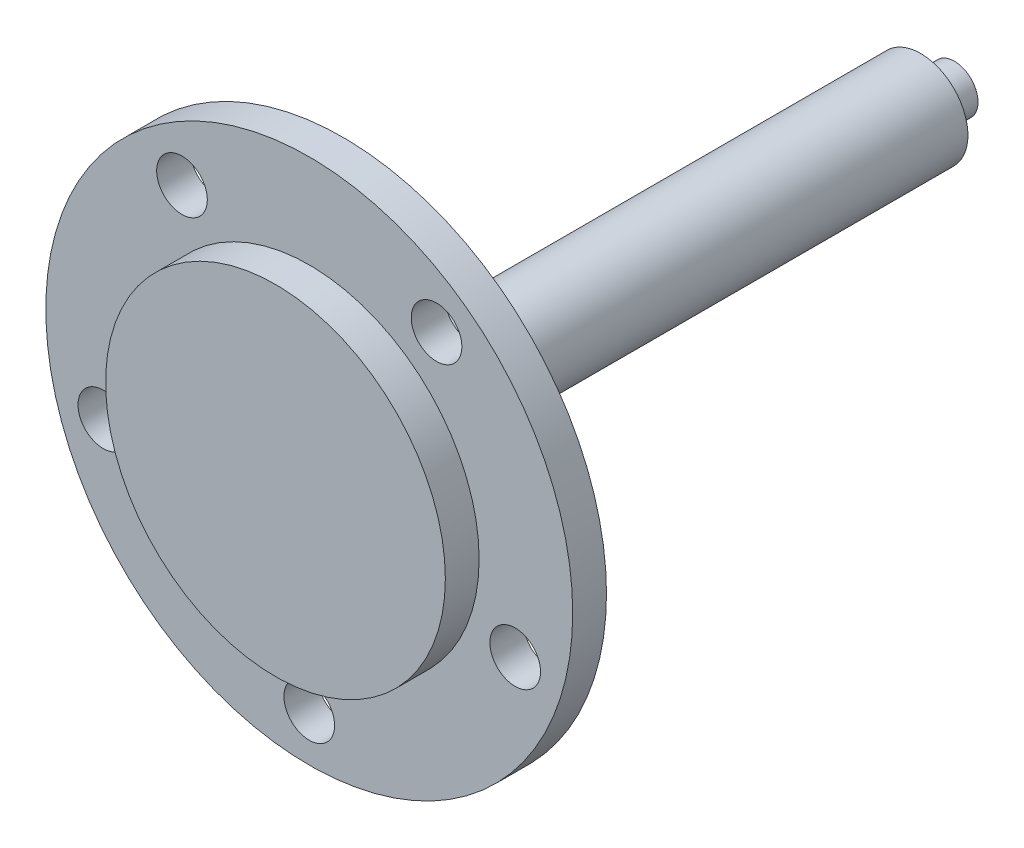
ISO-10303-21;
HEADER;
FILE_DESCRIPTION(('STEP AP214'),'2;1');
FILE_NAME('part.step','',(''),(''),'','','');
FILE_SCHEMA(('AUTOMOTIVE_DESIGN { 1 0 10303 214 1 1 1 1 }'));
ENDSEC;
DATA;
#1=APPLICATION_CONTEXT('core data for automotive mechanical design processes');
#2=APPLICATION_PROTOCOL_DEFINITION('international standard','automotive_design',2000,#1);
#3=PRODUCT_CONTEXT('',#1,'mechanical');
#4=PRODUCT('Part','Part','',(#3));
#5=PRODUCT_RELATED_PRODUCT_CATEGORY('part','',(#4));
#6=PRODUCT_DEFINITION_FORMATION('','',#4);
#7=PRODUCT_DEFINITION_CONTEXT('part definition',#1,'design');
#8=PRODUCT_DEFINITION('design','',#6,#7);
#9=PRODUCT_DEFINITION_SHAPE('','',#8);
#10=(LENGTH_UNIT() NAMED_UNIT(*) SI_UNIT(.MILLI.,.METRE.));
#11=(NAMED_UNIT(*) PLANE_ANGLE_UNIT() SI_UNIT($,.RADIAN.));
#12=(NAMED_UNIT(*) SI_UNIT($,.STERADIAN.) SOLID_ANGLE_UNIT());
#13=UNCERTAINTY_MEASURE_WITH_UNIT(LENGTH_MEASURE(1.E-05),#10,'distance_accuracy_value','');
#14=(GEOMETRIC_REPRESENTATION_CONTEXT(3) GLOBAL_UNCERTAINTY_ASSIGNED_CONTEXT((#13)) GLOBAL_UNIT_ASSIGNED_CONTEXT((#10,
#11,#12)) REPRESENTATION_CONTEXT('',''));
#15=CARTESIAN_POINT('',(0.,0.,0.));
#16=DIRECTION('',(0.,0.,1.));
#17=DIRECTION('',(1.,0.,0.));
#18=AXIS2_PLACEMENT_3D('',#15,#16,#17);
#19=CARTESIAN_POINT('',(0.,0.,18.));
#20=DIRECTION('',(0.,0.,-1.));
#21=DIRECTION('',(-1.,0.,0.));
#22=AXIS2_PLACEMENT_3D('',#19,#20,#21);
#23=CYLINDRICAL_SURFACE('',#22,14.);
#24=CARTESIAN_POINT('',(0.,0.,-3.));
#25=DIRECTION('',(0.,0.,-1.));
#26=DIRECTION('',(-1.,0.,0.));
#27=AXIS2_PLACEMENT_3D('',#24,#25,#26);
#28=CIRCLE('',#27,14.);
#29=CARTESIAN_POINT('',(-14.,0.,-3.));
#30=VERTEX_POINT('',#29);
#31=EDGE_CURVE('E39',#30,#30,#28,.T.);
#32=ORIENTED_EDGE('',*,*,#31,.F.);
#33=EDGE_LOOP('',(#32));
#34=FACE_BOUND('',#33,.T.);
#35=CARTESIAN_POINT('',(0.,0.,168.));
#36=DIRECTION('',(0.,0.,1.));
#37=DIRECTION('',(1.,0.,0.));
#38=AXIS2_PLACEMENT_3D('',#35,#36,#37);
#39=CIRCLE('',#38,14.);
#40=CARTESIAN_POINT('',(14.,0.,168.));
#41=VERTEX_POINT('',#40);
#42=EDGE_CURVE('E90',#41,#41,#39,.T.);
#43=ORIENTED_EDGE('',*,*,#42,.F.);
#44=EDGE_LOOP('',(#43));
#45=FACE_BOUND('',#44,.T.);
#46=ADVANCED_FACE('F36',(#34,#45),#23,.T.);
#47=CARTESIAN_POINT('',(0.,0.,-3.));
#48=DIRECTION('',(0.,0.,-1.));
#49=DIRECTION('',(-1.,0.,0.));
#50=AXIS2_PLACEMENT_3D('',#47,#48,#49);
#51=PLANE('',#50);
#52=CARTESIAN_POINT('',(0.,0.,-3.));
#53=DIRECTION('',(0.,0.,-1.));
#54=DIRECTION('',(-1.,0.,0.));
#55=AXIS2_PLACEMENT_3D('',#52,#53,#54);
#56=CIRCLE('',#55,7.);
#57=CARTESIAN_POINT('',(-7.,0.,-3.));
#58=VERTEX_POINT('',#57);
#59=EDGE_CURVE('E43',#58,#58,#56,.T.);
#60=ORIENTED_EDGE('',*,*,#59,.F.);
#61=EDGE_LOOP('',(#60));
#62=FACE_BOUND('',#61,.T.);
#63=ORIENTED_EDGE('',*,*,#31,.T.);
#64=EDGE_LOOP('',(#63));
#65=FACE_BOUND('',#64,.T.);
#66=ADVANCED_FACE('F97',(#62,#65),#51,.T.);
#67=CARTESIAN_POINT('',(0.,0.,-13.));
#68=DIRECTION('',(0.,0.,1.));
#69=DIRECTION('',(1.,0.,0.));
#70=AXIS2_PLACEMENT_3D('',#67,#68,#69);
#71=CYLINDRICAL_SURFACE('',#70,7.);
#72=CARTESIAN_POINT('',(0.,0.,-13.));
#73=DIRECTION('',(0.,0.,-1.));
#74=DIRECTION('',(-1.,0.,0.));
#75=AXIS2_PLACEMENT_3D('',#72,#73,#74);
#76=CIRCLE('',#75,7.);
#77=CARTESIAN_POINT('',(-7.,0.,-13.));
#78=VERTEX_POINT('',#77);
#79=EDGE_CURVE('E86',#78,#78,#76,.T.);
#80=ORIENTED_EDGE('',*,*,#79,.F.);
#81=EDGE_LOOP('',(#80));
#82=FACE_BOUND('',#81,.T.);
#83=ORIENTED_EDGE('',*,*,#59,.T.);
#84=EDGE_LOOP('',(#83));
#85=FACE_BOUND('',#84,.T.);
#86=ADVANCED_FACE('F104',(#82,#85),#71,.T.);
#87=CARTESIAN_POINT('',(0.,0.,-13.));
#88=DIRECTION('',(0.,0.,-1.));
#89=DIRECTION('',(-1.,0.,0.));
#90=AXIS2_PLACEMENT_3D('',#87,#88,#89);
#91=PLANE('',#90);
#92=ORIENTED_EDGE('',*,*,#79,.T.);
#93=EDGE_LOOP('',(#92));
#94=FACE_BOUND('',#93,.T.);
#95=ADVANCED_FACE('F109',(#94),#91,.T.);
#96=CARTESIAN_POINT('',(0.,0.,178.));
#97=DIRECTION('',(0.,0.,1.));
#98=DIRECTION('',(1.,0.,0.));
#99=AXIS2_PLACEMENT_3D('',#96,#97,#98);
#100=PLANE('',#99);
#101=CARTESIAN_POINT('',(0.,0.,178.));
#102=DIRECTION('',(0.,0.,1.));
#103=DIRECTION('',(1.,0.,0.));
#104=AXIS2_PLACEMENT_3D('',#101,#102,#103);
#105=CIRCLE('',#104,50.291796038);
#106=CARTESIAN_POINT('',(50.291796038,0.,178.));
#107=VERTEX_POINT('',#106);
#108=EDGE_CURVE('E10',#107,#107,#105,.T.);
#109=ORIENTED_EDGE('',*,*,#108,.F.);
#110=EDGE_LOOP('',(#109));
#111=FACE_BOUND('',#110,.T.);
#112=CARTESIAN_POINT('',(37.6815411803324,51.8641920160985,178.));
#113=DIRECTION('',(0.,0.,1.));
#114=DIRECTION('',(1.,0.,0.));
#115=AXIS2_PLACEMENT_3D('',#112,#113,#114);
#116=CIRCLE('',#115,7.5);
#117=CARTESIAN_POINT('',(45.1815411803324,51.8641920160985,178.));
#118=VERTEX_POINT('',#117);
#119=EDGE_CURVE('E59',#118,#118,#116,.T.);
#120=ORIENTED_EDGE('',*,*,#119,.F.);
#121=EDGE_LOOP('',(#120));
#122=FACE_BOUND('',#121,.T.);
#123=CARTESIAN_POINT('',(-60.9700143782559,-19.8103585510986,178.));
#124=DIRECTION('',(0.,0.,1.));
#125=DIRECTION('',(1.,0.,0.));
#126=AXIS2_PLACEMENT_3D('',#123,#124,#125);
#127=CIRCLE('',#126,7.50000000000001);
#128=CARTESIAN_POINT('',(-53.4700143782559,-19.8103585510986,178.));
#129=VERTEX_POINT('',#128);
#130=EDGE_CURVE('E71',#129,#129,#127,.T.);
#131=ORIENTED_EDGE('',*,*,#130,.F.);
#132=EDGE_LOOP('',(#131));
#133=FACE_BOUND('',#132,.T.);
#134=CARTESIAN_POINT('',(0.,0.,178.));
#135=DIRECTION('',(0.,0.,1.));
#136=DIRECTION('',(1.,0.,0.));
#137=AXIS2_PLACEMENT_3D('',#134,#135,#136);
#138=CIRCLE('',#137,78.);
#139=CARTESIAN_POINT('',(78.,0.,178.));
#140=VERTEX_POINT('',#139);
#141=EDGE_CURVE('E83',#140,#140,#138,.T.);
#142=ORIENTED_EDGE('',*,*,#141,.T.);
#143=EDGE_LOOP('',(#142));
#144=FACE_BOUND('',#143,.T.);
#145=CARTESIAN_POINT('',(0.,-64.10766693,178.));
#146=DIRECTION('',(0.,0.,1.));
#147=DIRECTION('',(1.,0.,0.));
#148=AXIS2_PLACEMENT_3D('',#145,#146,#147);
#149=CIRCLE('',#148,7.5);
#150=CARTESIAN_POINT('',(7.5,-64.10766693,178.));
#151=VERTEX_POINT('',#150);
#152=EDGE_CURVE('E77',#151,#151,#149,.T.);
#153=ORIENTED_EDGE('',*,*,#152,.F.);
#154=EDGE_LOOP('',(#153));
#155=FACE_BOUND('',#154,.T.);
#156=CARTESIAN_POINT('',(-37.6815411803316,51.864192016099,178.));
#157=DIRECTION('',(0.,0.,1.));
#158=DIRECTION('',(1.,0.,0.));
#159=AXIS2_PLACEMENT_3D('',#156,#157,#158);
#160=CIRCLE('',#159,7.5);
#161=CARTESIAN_POINT('',(-30.1815411803316,51.864192016099,178.));
#162=VERTEX_POINT('',#161);
#163=EDGE_CURVE('E65',#162,#162,#160,.T.);
#164=ORIENTED_EDGE('',*,*,#163,.F.);
#165=EDGE_LOOP('',(#164));
#166=FACE_BOUND('',#165,.T.);
#167=CARTESIAN_POINT('',(60.9700143782556,-19.8103585510995,178.));
#168=DIRECTION('',(0.,0.,1.));
#169=DIRECTION('',(1.,0.,0.));
#170=AXIS2_PLACEMENT_3D('',#167,#168,#169);
#171=CIRCLE('',#170,7.5);
#172=CARTESIAN_POINT('',(68.4700143782556,-19.8103585510995,178.));
#173=VERTEX_POINT('',#172);
#174=EDGE_CURVE('E52',#173,#173,#171,.T.);
#175=ORIENTED_EDGE('',*,*,#174,.F.);
#176=EDGE_LOOP('',(#175));
#177=FACE_BOUND('',#176,.T.);
#178=ADVANCED_FACE('F116',(#111,#122,#133,#144,#155,#166,#177),#100,.T.);
#179=CARTESIAN_POINT('',(0.,0.,168.));
#180=DIRECTION('',(0.,0.,1.));
#181=DIRECTION('',(1.,0.,0.));
#182=AXIS2_PLACEMENT_3D('',#179,#180,#181);
#183=PLANE('',#182);
#184=ORIENTED_EDGE('',*,*,#42,.T.);
#185=EDGE_LOOP('',(#184));
#186=FACE_BOUND('',#185,.T.);
#187=CARTESIAN_POINT('',(0.,0.,168.));
#188=DIRECTION('',(0.,0.,1.));
#189=DIRECTION('',(1.,0.,0.));
#190=AXIS2_PLACEMENT_3D('',#187,#188,#189);
#191=CIRCLE('',#190,78.);
#192=CARTESIAN_POINT('',(78.,0.,168.));
#193=VERTEX_POINT('',#192);
#194=EDGE_CURVE('E80',#193,#193,#191,.T.);
#195=ORIENTED_EDGE('',*,*,#194,.F.);
#196=EDGE_LOOP('',(#195));
#197=FACE_BOUND('',#196,.T.);
#198=CARTESIAN_POINT('',(0.,-64.10766693,168.));
#199=DIRECTION('',(0.,0.,1.));
#200=DIRECTION('',(1.,0.,0.));
#201=AXIS2_PLACEMENT_3D('',#198,#199,#200);
#202=CIRCLE('',#201,7.5);
#203=CARTESIAN_POINT('',(7.5,-64.10766693,168.));
#204=VERTEX_POINT('',#203);
#205=EDGE_CURVE('E74',#204,#204,#202,.T.);
#206=ORIENTED_EDGE('',*,*,#205,.T.);
#207=EDGE_LOOP('',(#206));
#208=FACE_BOUND('',#207,.T.);
#209=CARTESIAN_POINT('',(-60.9700143782559,-19.8103585510986,168.));
#210=DIRECTION('',(0.,0.,1.));
#211=DIRECTION('',(1.,0.,0.));
#212=AXIS2_PLACEMENT_3D('',#209,#210,#211);
#213=CIRCLE('',#212,7.50000000000001);
#214=CARTESIAN_POINT('',(-53.4700143782559,-19.8103585510986,168.));
#215=VERTEX_POINT('',#214);
#216=EDGE_CURVE('E68',#215,#215,#213,.T.);
#217=ORIENTED_EDGE('',*,*,#216,.T.);
#218=EDGE_LOOP('',(#217));
#219=FACE_BOUND('',#218,.T.);
#220=CARTESIAN_POINT('',(-37.6815411803316,51.864192016099,168.));
#221=DIRECTION('',(0.,0.,1.));
#222=DIRECTION('',(1.,0.,0.));
#223=AXIS2_PLACEMENT_3D('',#220,#221,#222);
#224=CIRCLE('',#223,7.5);
#225=CARTESIAN_POINT('',(-30.1815411803316,51.864192016099,168.));
#226=VERTEX_POINT('',#225);
#227=EDGE_CURVE('E62',#226,#226,#224,.T.);
#228=ORIENTED_EDGE('',*,*,#227,.T.);
#229=EDGE_LOOP('',(#228));
#230=FACE_BOUND('',#229,.T.);
#231=CARTESIAN_POINT('',(37.6815411803324,51.8641920160985,168.));
#232=DIRECTION('',(0.,0.,1.));
#233=DIRECTION('',(1.,0.,0.));
#234=AXIS2_PLACEMENT_3D('',#231,#232,#233);
#235=CIRCLE('',#234,7.5);
#236=CARTESIAN_POINT('',(45.1815411803324,51.8641920160985,168.));
#237=VERTEX_POINT('',#236);
#238=EDGE_CURVE('E55',#237,#237,#235,.T.);
#239=ORIENTED_EDGE('',*,*,#238,.T.);
#240=EDGE_LOOP('',(#239));
#241=FACE_BOUND('',#240,.T.);
#242=CARTESIAN_POINT('',(60.9700143782556,-19.8103585510995,168.));
#243=DIRECTION('',(0.,0.,1.));
#244=DIRECTION('',(1.,0.,0.));
#245=AXIS2_PLACEMENT_3D('',#242,#243,#244);
#246=CIRCLE('',#245,7.5);
#247=CARTESIAN_POINT('',(68.4700143782556,-19.8103585510995,168.));
#248=VERTEX_POINT('',#247);
#249=EDGE_CURVE('E56',#248,#248,#246,.T.);
#250=ORIENTED_EDGE('',*,*,#249,.T.);
#251=EDGE_LOOP('',(#250));
#252=FACE_BOUND('',#251,.T.);
#253=ADVANCED_FACE('F122',(#186,#197,#208,#219,#230,#241,#252),#183,.F.);
#254=CARTESIAN_POINT('',(0.,0.,178.));
#255=DIRECTION('',(0.,0.,-1.));
#256=DIRECTION('',(-1.,0.,0.));
#257=AXIS2_PLACEMENT_3D('',#254,#255,#256);
#258=CYLINDRICAL_SURFACE('',#257,78.);
#259=ORIENTED_EDGE('',*,*,#141,.F.);
#260=EDGE_LOOP('',(#259));
#261=FACE_BOUND('',#260,.T.);
#262=ORIENTED_EDGE('',*,*,#194,.T.);
#263=EDGE_LOOP('',(#262));
#264=FACE_BOUND('',#263,.T.);
#265=ADVANCED_FACE('F118',(#261,#264),#258,.T.);
#266=CARTESIAN_POINT('',(0.,-64.10766693,178.));
#267=DIRECTION('',(0.,0.,-1.));
#268=DIRECTION('',(-1.,0.,0.));
#269=AXIS2_PLACEMENT_3D('',#266,#267,#268);
#270=CYLINDRICAL_SURFACE('',#269,7.5);
#271=ORIENTED_EDGE('',*,*,#152,.T.);
#272=EDGE_LOOP('',(#271));
#273=FACE_BOUND('',#272,.T.);
#274=ORIENTED_EDGE('',*,*,#205,.F.);
#275=EDGE_LOOP('',(#274));
#276=FACE_BOUND('',#275,.T.);
#277=ADVANCED_FACE('F121',(#273,#276),#270,.F.);
#278=CARTESIAN_POINT('',(-60.9700143782559,-19.8103585510986,178.));
#279=DIRECTION('',(0.,0.,-1.));
#280=DIRECTION('',(-1.,0.,0.));
#281=AXIS2_PLACEMENT_3D('',#278,#279,#280);
#282=CYLINDRICAL_SURFACE('',#281,7.50000000000001);
#283=ORIENTED_EDGE('',*,*,#130,.T.);
#284=EDGE_LOOP('',(#283));
#285=FACE_BOUND('',#284,.T.);
#286=ORIENTED_EDGE('',*,*,#216,.F.);
#287=EDGE_LOOP('',(#286));
#288=FACE_BOUND('',#287,.T.);
#289=ADVANCED_FACE('F131',(#285,#288),#282,.F.);
#290=CARTESIAN_POINT('',(-37.6815411803316,51.864192016099,178.));
#291=DIRECTION('',(0.,0.,-1.));
#292=DIRECTION('',(-1.,0.,0.));
#293=AXIS2_PLACEMENT_3D('',#290,#291,#292);
#294=CYLINDRICAL_SURFACE('',#293,7.5);
#295=ORIENTED_EDGE('',*,*,#163,.T.);
#296=EDGE_LOOP('',(#295));
#297=FACE_BOUND('',#296,.T.);
#298=ORIENTED_EDGE('',*,*,#227,.F.);
#299=EDGE_LOOP('',(#298));
#300=FACE_BOUND('',#299,.T.);
#301=ADVANCED_FACE('F135',(#297,#300),#294,.F.);
#302=CARTESIAN_POINT('',(37.6815411803324,51.8641920160985,178.));
#303=DIRECTION('',(0.,0.,-1.));
#304=DIRECTION('',(-1.,0.,0.));
#305=AXIS2_PLACEMENT_3D('',#302,#303,#304);
#306=CYLINDRICAL_SURFACE('',#305,7.5);
#307=ORIENTED_EDGE('',*,*,#119,.T.);
#308=EDGE_LOOP('',(#307));
#309=FACE_BOUND('',#308,.T.);
#310=ORIENTED_EDGE('',*,*,#238,.F.);
#311=EDGE_LOOP('',(#310));
#312=FACE_BOUND('',#311,.T.);
#313=ADVANCED_FACE('F139',(#309,#312),#306,.F.);
#314=CARTESIAN_POINT('',(60.9700143782556,-19.8103585510995,178.));
#315=DIRECTION('',(0.,0.,-1.));
#316=DIRECTION('',(-1.,0.,0.));
#317=AXIS2_PLACEMENT_3D('',#314,#315,#316);
#318=CYLINDRICAL_SURFACE('',#317,7.5);
#319=ORIENTED_EDGE('',*,*,#174,.T.);
#320=EDGE_LOOP('',(#319));
#321=FACE_BOUND('',#320,.T.);
#322=ORIENTED_EDGE('',*,*,#249,.F.);
#323=EDGE_LOOP('',(#322));
#324=FACE_BOUND('',#323,.T.);
#325=ADVANCED_FACE('F143',(#321,#324),#318,.F.);
#326=CARTESIAN_POINT('',(0.,0.,188.));
#327=DIRECTION('',(0.,0.,-1.));
#328=DIRECTION('',(-1.,0.,0.));
#329=AXIS2_PLACEMENT_3D('',#326,#327,#328);
#330=CYLINDRICAL_SURFACE('',#329,50.291796038);
#331=CARTESIAN_POINT('',(0.,0.,188.));
#332=DIRECTION('',(0.,0.,1.));
#333=DIRECTION('',(1.,0.,0.));
#334=AXIS2_PLACEMENT_3D('',#331,#332,#333);
#335=CIRCLE('',#334,50.291796038);
#336=CARTESIAN_POINT('',(50.291796038,0.,188.));
#337=VERTEX_POINT('',#336);
#338=EDGE_CURVE('E51',#337,#337,#335,.T.);
#339=ORIENTED_EDGE('',*,*,#338,.F.);
#340=EDGE_LOOP('',(#339));
#341=FACE_BOUND('',#340,.T.);
#342=ORIENTED_EDGE('',*,*,#108,.T.);
#343=EDGE_LOOP('',(#342));
#344=FACE_BOUND('',#343,.T.);
#345=ADVANCED_FACE('F147',(#341,#344),#330,.T.);
#346=CARTESIAN_POINT('',(0.,0.,188.));
#347=DIRECTION('',(0.,0.,1.));
#348=DIRECTION('',(1.,0.,0.));
#349=AXIS2_PLACEMENT_3D('',#346,#347,#348);
#350=PLANE('',#349);
#351=ORIENTED_EDGE('',*,*,#338,.T.);
#352=EDGE_LOOP('',(#351));
#353=FACE_BOUND('',#352,.T.);
#354=ADVANCED_FACE('F151',(#353),#350,.T.);
#355=CLOSED_SHELL('',(#46,#66,#86,#95,#178,#253,#265,#277,#289,#301,#313,#325,#345,#354));
#356=MANIFOLD_SOLID_BREP('B2',#355);
#357=ADVANCED_BREP_SHAPE_REPRESENTATION('',(#18,#356),#14);
#358=SHAPE_DEFINITION_REPRESENTATION(#9,#357);
ENDSEC;
END-ISO-10303-21;
